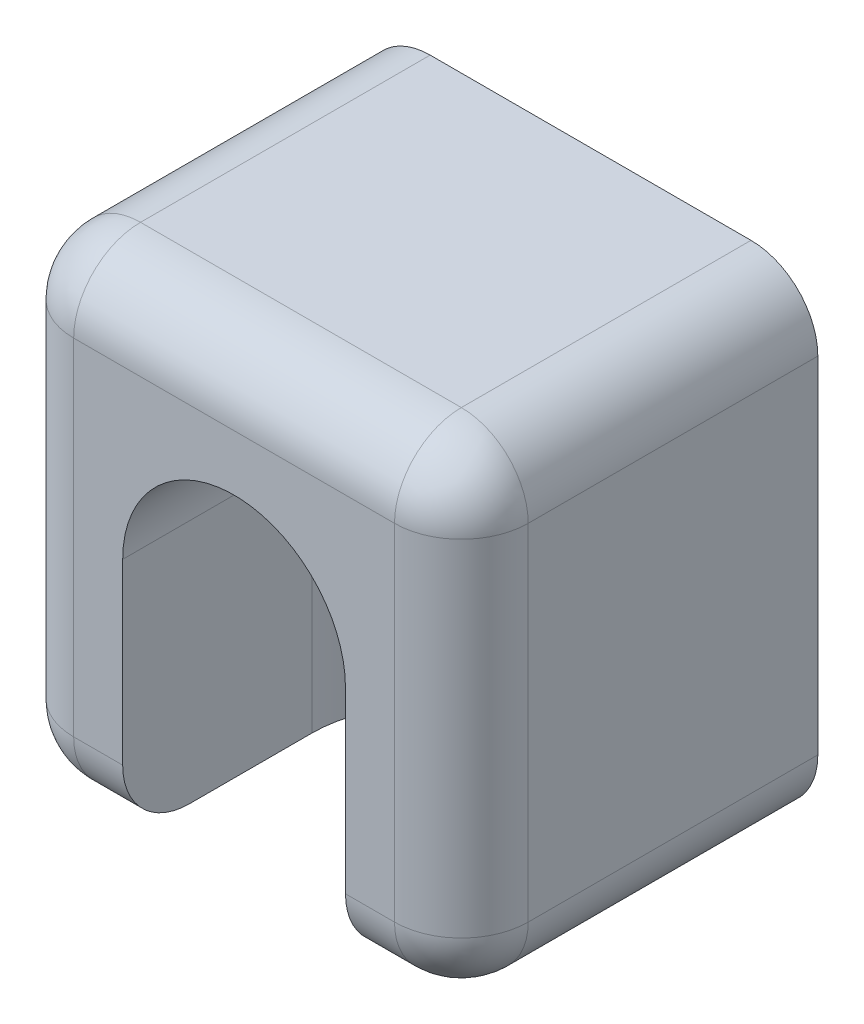
ISO-10303-21;
HEADER;
FILE_DESCRIPTION(('STEP AP214'),'2;1');
FILE_NAME('part.step','',(''),(''),'','','');
FILE_SCHEMA(('AUTOMOTIVE_DESIGN { 1 0 10303 214 1 1 1 1 }'));
ENDSEC;
DATA;
#1=APPLICATION_CONTEXT('core data for automotive mechanical design processes');
#2=APPLICATION_PROTOCOL_DEFINITION('international standard','automotive_design',2000,#1);
#3=PRODUCT_CONTEXT('',#1,'mechanical');
#4=PRODUCT('Part','Part','',(#3));
#5=PRODUCT_RELATED_PRODUCT_CATEGORY('part','',(#4));
#6=PRODUCT_DEFINITION_FORMATION('','',#4);
#7=PRODUCT_DEFINITION_CONTEXT('part definition',#1,'design');
#8=PRODUCT_DEFINITION('design','',#6,#7);
#9=PRODUCT_DEFINITION_SHAPE('','',#8);
#10=(LENGTH_UNIT() NAMED_UNIT(*) SI_UNIT(.MILLI.,.METRE.));
#11=(NAMED_UNIT(*) PLANE_ANGLE_UNIT() SI_UNIT($,.RADIAN.));
#12=(NAMED_UNIT(*) SI_UNIT($,.STERADIAN.) SOLID_ANGLE_UNIT());
#13=UNCERTAINTY_MEASURE_WITH_UNIT(LENGTH_MEASURE(1.E-05),#10,'distance_accuracy_value','');
#14=(GEOMETRIC_REPRESENTATION_CONTEXT(3) GLOBAL_UNCERTAINTY_ASSIGNED_CONTEXT((#13)) GLOBAL_UNIT_ASSIGNED_CONTEXT((#10,
#11,#12)) REPRESENTATION_CONTEXT('',''));
#15=CARTESIAN_POINT('',(0.,0.,0.));
#16=DIRECTION('',(0.,0.,1.));
#17=DIRECTION('',(1.,0.,0.));
#18=AXIS2_PLACEMENT_3D('',#15,#16,#17);
#19=CARTESIAN_POINT('',(10.2,0.,-8.5));
#20=DIRECTION('',(0.,1.,0.));
#21=DIRECTION('',(0.,0.,1.));
#22=AXIS2_PLACEMENT_3D('',#19,#20,#21);
#23=CYLINDRICAL_SURFACE('',#22,5.);
#24=DIRECTION('',(0.,1.,0.));
#25=VECTOR('',#24,1.);
#26=CARTESIAN_POINT('',(5.2,-0.999999999999999,-8.5));
#27=LINE('',#26,#25);
#28=CARTESIAN_POINT('',(5.2,0.,-8.5));
#29=VERTEX_POINT('',#28);
#30=CARTESIAN_POINT('',(5.2,11.,-8.5));
#31=VERTEX_POINT('',#30);
#32=EDGE_CURVE('E213',#29,#31,#27,.T.);
#33=ORIENTED_EDGE('',*,*,#32,.F.);
#34=CARTESIAN_POINT('',(10.2,0.,-8.5));
#35=DIRECTION('',(0.,-1.,0.));
#36=DIRECTION('',(0.,0.,-1.));
#37=AXIS2_PLACEMENT_3D('',#34,#35,#36);
#38=CIRCLE('',#37,5.);
#39=CARTESIAN_POINT('',(15.2,0.,-8.5));
#40=VERTEX_POINT('',#39);
#41=EDGE_CURVE('E11',#29,#40,#38,.T.);
#42=ORIENTED_EDGE('',*,*,#41,.T.);
#43=DIRECTION('',(0.,-1.,0.));
#44=VECTOR('',#43,1.);
#45=CARTESIAN_POINT('',(15.2,0.,-8.5));
#46=LINE('',#45,#44);
#47=CARTESIAN_POINT('',(15.2,11.,-8.5));
#48=VERTEX_POINT('',#47);
#49=EDGE_CURVE('E41',#48,#40,#46,.T.);
#50=ORIENTED_EDGE('',*,*,#49,.F.);
#51=CARTESIAN_POINT('',(10.2,11.,-8.5));
#52=DIRECTION('',(0.,0.707106781186547,0.707106781186547));
#53=DIRECTION('',(0.,0.707106781186548,-0.707106781186547));
#54=AXIS2_PLACEMENT_3D('',#51,#52,#53);
#55=ELLIPSE('',#54,7.07106781186547,5.);
#56=EDGE_CURVE('E216',#31,#48,#55,.F.);
#57=ORIENTED_EDGE('',*,*,#56,.F.);
#58=EDGE_LOOP('',(#33,#42,#50,#57));
#59=FACE_BOUND('',#58,.T.);
#60=ADVANCED_FACE('F34',(#59),#23,.F.);
#61=CARTESIAN_POINT('',(10.2,11.,-13.5));
#62=DIRECTION('',(0.,0.,1.));
#63=DIRECTION('',(1.,0.,0.));
#64=AXIS2_PLACEMENT_3D('',#61,#62,#63);
#65=CYLINDRICAL_SURFACE('',#64,5.);
#66=DIRECTION('',(0.,0.,1.));
#67=VECTOR('',#66,1.);
#68=CARTESIAN_POINT('',(5.2,11.,0.999999999999999));
#69=LINE('',#68,#67);
#70=CARTESIAN_POINT('',(5.2,11.,0.));
#71=VERTEX_POINT('',#70);
#72=EDGE_CURVE('E208',#31,#71,#69,.T.);
#73=ORIENTED_EDGE('',*,*,#72,.F.);
#74=ORIENTED_EDGE('',*,*,#56,.T.);
#75=DIRECTION('',(0.,0.,-1.));
#76=VECTOR('',#75,1.);
#77=CARTESIAN_POINT('',(15.2,11.,-13.5));
#78=LINE('',#77,#76);
#79=CARTESIAN_POINT('',(15.2,11.,0.));
#80=VERTEX_POINT('',#79);
#81=EDGE_CURVE('E210',#80,#48,#78,.T.);
#82=ORIENTED_EDGE('',*,*,#81,.F.);
#83=CARTESIAN_POINT('',(10.2,11.,0.));
#84=DIRECTION('',(0.,0.,-1.));
#85=DIRECTION('',(-1.,0.,0.));
#86=AXIS2_PLACEMENT_3D('',#83,#84,#85);
#87=CIRCLE('',#86,5.);
#88=EDGE_CURVE('E143',#80,#71,#87,.F.);
#89=ORIENTED_EDGE('',*,*,#88,.T.);
#90=EDGE_LOOP('',(#73,#74,#82,#89));
#91=FACE_BOUND('',#90,.T.);
#92=ADVANCED_FACE('F297',(#91),#65,.F.);
#93=CARTESIAN_POINT('',(0.,0.,-16.));
#94=DIRECTION('',(0.,-1.,0.));
#95=DIRECTION('',(0.,0.,-1.));
#96=AXIS2_PLACEMENT_3D('',#93,#94,#95);
#97=PLANE('',#96);
#98=ORIENTED_EDGE('',*,*,#41,.F.);
#99=DIRECTION('',(0.,0.,1.));
#100=VECTOR('',#99,1.);
#101=CARTESIAN_POINT('',(5.2,0.,-16.));
#102=LINE('',#101,#100);
#103=CARTESIAN_POINT('',(5.2,0.,-3.));
#104=VERTEX_POINT('',#103);
#105=EDGE_CURVE('E176',#29,#104,#102,.T.);
#106=ORIENTED_EDGE('',*,*,#105,.T.);
#107=DIRECTION('',(1.,0.,0.));
#108=VECTOR('',#107,1.);
#109=CARTESIAN_POINT('',(0.,0.,-3.));
#110=LINE('',#109,#108);
#111=CARTESIAN_POINT('',(3.,0.,-3.));
#112=VERTEX_POINT('',#111);
#113=EDGE_CURVE('E237',#104,#112,#110,.F.);
#114=ORIENTED_EDGE('',*,*,#113,.T.);
#115=DIRECTION('',(0.,0.,1.));
#116=VECTOR('',#115,1.);
#117=CARTESIAN_POINT('',(3.,0.,-16.));
#118=LINE('',#117,#116);
#119=CARTESIAN_POINT('',(3.,0.,-16.));
#120=VERTEX_POINT('',#119);
#121=EDGE_CURVE('E239',#112,#120,#118,.F.);
#122=ORIENTED_EDGE('',*,*,#121,.T.);
#123=DIRECTION('',(1.,0.,0.));
#124=VECTOR('',#123,1.);
#125=CARTESIAN_POINT('',(0.,0.,-16.));
#126=LINE('',#125,#124);
#127=CARTESIAN_POINT('',(17.4,0.,-16.));
#128=VERTEX_POINT('',#127);
#129=EDGE_CURVE('E228',#120,#128,#126,.T.);
#130=ORIENTED_EDGE('',*,*,#129,.T.);
#131=DIRECTION('',(0.,0.,1.));
#132=VECTOR('',#131,1.);
#133=CARTESIAN_POINT('',(17.4,0.,-16.));
#134=LINE('',#133,#132);
#135=CARTESIAN_POINT('',(17.4,0.,-3.));
#136=VERTEX_POINT('',#135);
#137=EDGE_CURVE('E241',#128,#136,#134,.T.);
#138=ORIENTED_EDGE('',*,*,#137,.T.);
#139=CARTESIAN_POINT('',(15.2,0.,-3.));
#140=VERTEX_POINT('',#139);
#141=EDGE_CURVE('E220',#136,#140,#110,.F.);
#142=ORIENTED_EDGE('',*,*,#141,.T.);
#143=DIRECTION('',(0.,0.,1.));
#144=VECTOR('',#143,1.);
#145=CARTESIAN_POINT('',(15.2,0.,-16.));
#146=LINE('',#145,#144);
#147=EDGE_CURVE('E147',#40,#140,#146,.T.);
#148=ORIENTED_EDGE('',*,*,#147,.F.);
#149=EDGE_LOOP('',(#98,#106,#114,#122,#130,#138,#142,#148));
#150=FACE_BOUND('',#149,.T.);
#151=ADVANCED_FACE('F218',(#150),#97,.T.);
#152=CARTESIAN_POINT('',(0.,21.5,0.));
#153=DIRECTION('',(0.,0.,-1.));
#154=DIRECTION('',(-1.,0.,0.));
#155=AXIS2_PLACEMENT_3D('',#152,#153,#154);
#156=PLANE('',#155);
#157=ORIENTED_EDGE('',*,*,#88,.F.);
#158=DIRECTION('',(0.,-1.,0.));
#159=VECTOR('',#158,1.);
#160=CARTESIAN_POINT('',(15.2,21.5,0.));
#161=LINE('',#160,#159);
#162=CARTESIAN_POINT('',(15.2,3.,0.));
#163=VERTEX_POINT('',#162);
#164=EDGE_CURVE('E134',#80,#163,#161,.T.);
#165=ORIENTED_EDGE('',*,*,#164,.T.);
#166=DIRECTION('',(1.,0.,0.));
#167=VECTOR('',#166,1.);
#168=CARTESIAN_POINT('',(20.4,3.,0.));
#169=LINE('',#168,#167);
#170=CARTESIAN_POINT('',(17.4,3.,0.));
#171=VERTEX_POINT('',#170);
#172=EDGE_CURVE('E139',#163,#171,#169,.T.);
#173=ORIENTED_EDGE('',*,*,#172,.T.);
#174=DIRECTION('',(0.,1.,0.));
#175=VECTOR('',#174,1.);
#176=CARTESIAN_POINT('',(17.4,21.5,0.));
#177=LINE('',#176,#175);
#178=CARTESIAN_POINT('',(17.4,18.5,0.));
#179=VERTEX_POINT('',#178);
#180=EDGE_CURVE('E157',#171,#179,#177,.T.);
#181=ORIENTED_EDGE('',*,*,#180,.T.);
#182=DIRECTION('',(-1.,0.,0.));
#183=VECTOR('',#182,1.);
#184=CARTESIAN_POINT('',(0.,18.5,0.));
#185=LINE('',#184,#183);
#186=CARTESIAN_POINT('',(3.,18.5,0.));
#187=VERTEX_POINT('',#186);
#188=EDGE_CURVE('E168',#179,#187,#185,.T.);
#189=ORIENTED_EDGE('',*,*,#188,.T.);
#190=DIRECTION('',(0.,-1.,0.));
#191=VECTOR('',#190,1.);
#192=CARTESIAN_POINT('',(3.,0.,0.));
#193=LINE('',#192,#191);
#194=CARTESIAN_POINT('',(3.,3.,0.));
#195=VERTEX_POINT('',#194);
#196=EDGE_CURVE('E165',#187,#195,#193,.T.);
#197=ORIENTED_EDGE('',*,*,#196,.T.);
#198=CARTESIAN_POINT('',(5.2,3.,0.));
#199=VERTEX_POINT('',#198);
#200=EDGE_CURVE('E164',#195,#199,#169,.T.);
#201=ORIENTED_EDGE('',*,*,#200,.T.);
#202=DIRECTION('',(0.,-1.,0.));
#203=VECTOR('',#202,1.);
#204=CARTESIAN_POINT('',(5.2,21.5,0.));
#205=LINE('',#204,#203);
#206=EDGE_CURVE('E221',#71,#199,#205,.T.);
#207=ORIENTED_EDGE('',*,*,#206,.F.);
#208=EDGE_LOOP('',(#157,#165,#173,#181,#189,#197,#201,#207));
#209=FACE_BOUND('',#208,.T.);
#210=ADVANCED_FACE('F136',(#209),#156,.F.);
#211=CARTESIAN_POINT('',(0.,3.,-3.));
#212=DIRECTION('',(-1.,0.,0.));
#213=DIRECTION('',(0.,0.,1.));
#214=AXIS2_PLACEMENT_3D('',#211,#212,#213);
#215=CYLINDRICAL_SURFACE('',#214,3.);
#216=ORIENTED_EDGE('',*,*,#113,.F.);
#217=CARTESIAN_POINT('',(5.2,3.,-3.));
#218=DIRECTION('',(1.,0.,0.));
#219=DIRECTION('',(0.,0.,-1.));
#220=AXIS2_PLACEMENT_3D('',#217,#218,#219);
#221=CIRCLE('',#220,3.);
#222=EDGE_CURVE('E156',#104,#199,#221,.F.);
#223=ORIENTED_EDGE('',*,*,#222,.T.);
#224=ORIENTED_EDGE('',*,*,#200,.F.);
#225=CARTESIAN_POINT('',(3.,3.,-3.));
#226=DIRECTION('',(-1.,0.,0.));
#227=DIRECTION('',(0.,0.,1.));
#228=AXIS2_PLACEMENT_3D('',#225,#226,#227);
#229=CIRCLE('',#228,3.);
#230=EDGE_CURVE('E181',#195,#112,#229,.F.);
#231=ORIENTED_EDGE('',*,*,#230,.T.);
#232=EDGE_LOOP('',(#216,#223,#224,#231));
#233=FACE_BOUND('',#232,.T.);
#234=ADVANCED_FACE('F290',(#233),#215,.T.);
#235=CARTESIAN_POINT('',(0.,0.,-16.));
#236=DIRECTION('',(-1.,0.,0.));
#237=DIRECTION('',(0.,0.,1.));
#238=AXIS2_PLACEMENT_3D('',#235,#236,#237);
#239=PLANE('',#238);
#240=DIRECTION('',(0.,-1.,0.));
#241=VECTOR('',#240,1.);
#242=CARTESIAN_POINT('',(0.,21.5,-3.));
#243=LINE('',#242,#241);
#244=CARTESIAN_POINT('',(0.,3.,-3.));
#245=VERTEX_POINT('',#244);
#246=CARTESIAN_POINT('',(0.,18.5,-3.));
#247=VERTEX_POINT('',#246);
#248=EDGE_CURVE('E263',#245,#247,#243,.F.);
#249=ORIENTED_EDGE('',*,*,#248,.T.);
#250=DIRECTION('',(0.,0.,1.));
#251=VECTOR('',#250,1.);
#252=CARTESIAN_POINT('',(0.,18.5,-16.));
#253=LINE('',#252,#251);
#254=CARTESIAN_POINT('',(0.,18.5,-16.));
#255=VERTEX_POINT('',#254);
#256=EDGE_CURVE('E267',#247,#255,#253,.F.);
#257=ORIENTED_EDGE('',*,*,#256,.T.);
#258=DIRECTION('',(0.,-1.,0.));
#259=VECTOR('',#258,1.);
#260=CARTESIAN_POINT('',(0.,0.,-16.));
#261=LINE('',#260,#259);
#262=CARTESIAN_POINT('',(0.,3.,-16.));
#263=VERTEX_POINT('',#262);
#264=EDGE_CURVE('E204',#255,#263,#261,.T.);
#265=ORIENTED_EDGE('',*,*,#264,.T.);
#266=DIRECTION('',(0.,0.,1.));
#267=VECTOR('',#266,1.);
#268=CARTESIAN_POINT('',(0.,3.,-16.));
#269=LINE('',#268,#267);
#270=EDGE_CURVE('E265',#263,#245,#269,.T.);
#271=ORIENTED_EDGE('',*,*,#270,.T.);
#272=EDGE_LOOP('',(#249,#257,#265,#271));
#273=FACE_BOUND('',#272,.T.);
#274=ADVANCED_FACE('F310',(#273),#239,.T.);
#275=CARTESIAN_POINT('',(0.,21.5,-16.));
#276=DIRECTION('',(0.,1.,0.));
#277=DIRECTION('',(0.,0.,1.));
#278=AXIS2_PLACEMENT_3D('',#275,#276,#277);
#279=PLANE('',#278);
#280=DIRECTION('',(-1.,0.,0.));
#281=VECTOR('',#280,1.);
#282=CARTESIAN_POINT('',(20.4,21.5,-3.));
#283=LINE('',#282,#281);
#284=CARTESIAN_POINT('',(3.,21.5,-3.));
#285=VERTEX_POINT('',#284);
#286=CARTESIAN_POINT('',(17.4,21.5,-3.));
#287=VERTEX_POINT('',#286);
#288=EDGE_CURVE('E257',#285,#287,#283,.F.);
#289=ORIENTED_EDGE('',*,*,#288,.T.);
#290=DIRECTION('',(0.,0.,1.));
#291=VECTOR('',#290,1.);
#292=CARTESIAN_POINT('',(17.4,21.5,-16.));
#293=LINE('',#292,#291);
#294=CARTESIAN_POINT('',(17.4,21.5,-16.));
#295=VERTEX_POINT('',#294);
#296=EDGE_CURVE('E261',#287,#295,#293,.F.);
#297=ORIENTED_EDGE('',*,*,#296,.T.);
#298=DIRECTION('',(-1.,0.,0.));
#299=VECTOR('',#298,1.);
#300=CARTESIAN_POINT('',(0.,21.5,-16.));
#301=LINE('',#300,#299);
#302=CARTESIAN_POINT('',(3.,21.5,-16.));
#303=VERTEX_POINT('',#302);
#304=EDGE_CURVE('E234',#295,#303,#301,.T.);
#305=ORIENTED_EDGE('',*,*,#304,.T.);
#306=DIRECTION('',(0.,0.,1.));
#307=VECTOR('',#306,1.);
#308=CARTESIAN_POINT('',(3.,21.5,-16.));
#309=LINE('',#308,#307);
#310=EDGE_CURVE('E259',#303,#285,#309,.T.);
#311=ORIENTED_EDGE('',*,*,#310,.T.);
#312=EDGE_LOOP('',(#289,#297,#305,#311));
#313=FACE_BOUND('',#312,.T.);
#314=ADVANCED_FACE('F318',(#313),#279,.T.);
#315=CARTESIAN_POINT('',(20.4,0.,-16.));
#316=DIRECTION('',(1.,0.,0.));
#317=DIRECTION('',(0.,0.,-1.));
#318=AXIS2_PLACEMENT_3D('',#315,#316,#317);
#319=PLANE('',#318);
#320=DIRECTION('',(0.,1.,0.));
#321=VECTOR('',#320,1.);
#322=CARTESIAN_POINT('',(20.4,0.,-3.));
#323=LINE('',#322,#321);
#324=CARTESIAN_POINT('',(20.4,18.5,-3.));
#325=VERTEX_POINT('',#324);
#326=CARTESIAN_POINT('',(20.4,3.,-3.));
#327=VERTEX_POINT('',#326);
#328=EDGE_CURVE('E243',#325,#327,#323,.F.);
#329=ORIENTED_EDGE('',*,*,#328,.T.);
#330=DIRECTION('',(0.,0.,1.));
#331=VECTOR('',#330,1.);
#332=CARTESIAN_POINT('',(20.4,3.,-16.));
#333=LINE('',#332,#331);
#334=CARTESIAN_POINT('',(20.4,3.,-16.));
#335=VERTEX_POINT('',#334);
#336=EDGE_CURVE('E247',#327,#335,#333,.F.);
#337=ORIENTED_EDGE('',*,*,#336,.T.);
#338=DIRECTION('',(0.,1.,0.));
#339=VECTOR('',#338,1.);
#340=CARTESIAN_POINT('',(20.4,0.,-16.));
#341=LINE('',#340,#339);
#342=CARTESIAN_POINT('',(20.4,18.5,-16.));
#343=VERTEX_POINT('',#342);
#344=EDGE_CURVE('E231',#335,#343,#341,.T.);
#345=ORIENTED_EDGE('',*,*,#344,.T.);
#346=DIRECTION('',(0.,0.,1.));
#347=VECTOR('',#346,1.);
#348=CARTESIAN_POINT('',(20.4,18.5,-16.));
#349=LINE('',#348,#347);
#350=EDGE_CURVE('E245',#343,#325,#349,.T.);
#351=ORIENTED_EDGE('',*,*,#350,.T.);
#352=EDGE_LOOP('',(#329,#337,#345,#351));
#353=FACE_BOUND('',#352,.T.);
#354=ADVANCED_FACE('F333',(#353),#319,.T.);
#355=CARTESIAN_POINT('',(0.,21.5,-16.));
#356=DIRECTION('',(0.,0.,-1.));
#357=DIRECTION('',(-1.,0.,0.));
#358=AXIS2_PLACEMENT_3D('',#355,#356,#357);
#359=PLANE('',#358);
#360=ORIENTED_EDGE('',*,*,#344,.F.);
#361=CARTESIAN_POINT('',(17.4,3.,-16.));
#362=DIRECTION('',(0.,0.,-1.));
#363=DIRECTION('',(-1.,0.,0.));
#364=AXIS2_PLACEMENT_3D('',#361,#362,#363);
#365=CIRCLE('',#364,3.);
#366=EDGE_CURVE('E255',#335,#128,#365,.T.);
#367=ORIENTED_EDGE('',*,*,#366,.T.);
#368=ORIENTED_EDGE('',*,*,#129,.F.);
#369=CARTESIAN_POINT('',(3.,3.,-16.));
#370=DIRECTION('',(0.,0.,-1.));
#371=DIRECTION('',(-1.,0.,0.));
#372=AXIS2_PLACEMENT_3D('',#369,#370,#371);
#373=CIRCLE('',#372,3.);
#374=EDGE_CURVE('E249',#120,#263,#373,.T.);
#375=ORIENTED_EDGE('',*,*,#374,.T.);
#376=ORIENTED_EDGE('',*,*,#264,.F.);
#377=CARTESIAN_POINT('',(3.,18.5,-16.));
#378=DIRECTION('',(0.,0.,-1.));
#379=DIRECTION('',(-1.,0.,0.));
#380=AXIS2_PLACEMENT_3D('',#377,#378,#379);
#381=CIRCLE('',#380,3.);
#382=EDGE_CURVE('E251',#255,#303,#381,.T.);
#383=ORIENTED_EDGE('',*,*,#382,.T.);
#384=ORIENTED_EDGE('',*,*,#304,.F.);
#385=CARTESIAN_POINT('',(17.4,18.5,-16.));
#386=DIRECTION('',(0.,0.,-1.));
#387=DIRECTION('',(-1.,0.,0.));
#388=AXIS2_PLACEMENT_3D('',#385,#386,#387);
#389=CIRCLE('',#388,3.);
#390=EDGE_CURVE('E253',#295,#343,#389,.T.);
#391=ORIENTED_EDGE('',*,*,#390,.T.);
#392=EDGE_LOOP('',(#360,#367,#368,#375,#376,#383,#384,#391));
#393=FACE_BOUND('',#392,.T.);
#394=ADVANCED_FACE('F307',(#393),#359,.T.);
#395=CARTESIAN_POINT('',(3.,18.5,-16.));
#396=DIRECTION('',(0.,0.,1.));
#397=DIRECTION('',(1.,0.,0.));
#398=AXIS2_PLACEMENT_3D('',#395,#396,#397);
#399=CYLINDRICAL_SURFACE('',#398,3.);
#400=CARTESIAN_POINT('',(3.,18.5,-3.));
#401=DIRECTION('',(0.,0.,1.));
#402=DIRECTION('',(1.,0.,0.));
#403=AXIS2_PLACEMENT_3D('',#400,#401,#402);
#404=CIRCLE('',#403,3.);
#405=EDGE_CURVE('E202',#285,#247,#404,.T.);
#406=ORIENTED_EDGE('',*,*,#405,.F.);
#407=ORIENTED_EDGE('',*,*,#310,.F.);
#408=ORIENTED_EDGE('',*,*,#382,.F.);
#409=ORIENTED_EDGE('',*,*,#256,.F.);
#410=EDGE_LOOP('',(#406,#407,#408,#409));
#411=FACE_BOUND('',#410,.T.);
#412=ADVANCED_FACE('F313',(#411),#399,.T.);
#413=CARTESIAN_POINT('',(3.,18.5,-3.));
#414=DIRECTION('',(0.,0.,1.));
#415=DIRECTION('',(1.,0.,0.));
#416=AXIS2_PLACEMENT_3D('',#413,#414,#415);
#417=SPHERICAL_SURFACE('',#416,3.);
#418=CARTESIAN_POINT('',(3.,18.5,-3.));
#419=DIRECTION('',(-1.,0.,0.));
#420=DIRECTION('',(0.,0.,1.));
#421=AXIS2_PLACEMENT_3D('',#418,#419,#420);
#422=CIRCLE('',#421,3.);
#423=EDGE_CURVE('E196',#285,#187,#422,.F.);
#424=ORIENTED_EDGE('',*,*,#423,.F.);
#425=ORIENTED_EDGE('',*,*,#405,.T.);
#426=CARTESIAN_POINT('',(3.,18.5,-3.));
#427=DIRECTION('',(0.,1.,0.));
#428=DIRECTION('',(0.,0.,1.));
#429=AXIS2_PLACEMENT_3D('',#426,#427,#428);
#430=CIRCLE('',#429,3.);
#431=EDGE_CURVE('E199',#187,#247,#430,.F.);
#432=ORIENTED_EDGE('',*,*,#431,.F.);
#433=EDGE_LOOP('',(#424,#425,#432));
#434=FACE_BOUND('',#433,.T.);
#435=ADVANCED_FACE('F278',(#434),#417,.T.);
#436=CARTESIAN_POINT('',(3.,3.,-16.));
#437=DIRECTION('',(0.,0.,1.));
#438=DIRECTION('',(1.,0.,0.));
#439=AXIS2_PLACEMENT_3D('',#436,#437,#438);
#440=CYLINDRICAL_SURFACE('',#439,3.);
#441=ORIENTED_EDGE('',*,*,#374,.F.);
#442=ORIENTED_EDGE('',*,*,#121,.F.);
#443=CARTESIAN_POINT('',(3.,3.,-3.));
#444=DIRECTION('',(0.,0.,1.));
#445=DIRECTION('',(1.,0.,0.));
#446=AXIS2_PLACEMENT_3D('',#443,#444,#445);
#447=CIRCLE('',#446,3.);
#448=EDGE_CURVE('E193',#245,#112,#447,.T.);
#449=ORIENTED_EDGE('',*,*,#448,.F.);
#450=ORIENTED_EDGE('',*,*,#270,.F.);
#451=EDGE_LOOP('',(#441,#442,#449,#450));
#452=FACE_BOUND('',#451,.T.);
#453=ADVANCED_FACE('F302',(#452),#440,.T.);
#454=CARTESIAN_POINT('',(3.,21.5,-3.));
#455=DIRECTION('',(0.,1.,0.));
#456=DIRECTION('',(0.,0.,1.));
#457=AXIS2_PLACEMENT_3D('',#454,#455,#456);
#458=CYLINDRICAL_SURFACE('',#457,3.);
#459=ORIENTED_EDGE('',*,*,#431,.T.);
#460=ORIENTED_EDGE('',*,*,#248,.F.);
#461=CARTESIAN_POINT('',(3.,3.,-3.));
#462=DIRECTION('',(0.,-1.,0.));
#463=DIRECTION('',(1.,0.,0.));
#464=AXIS2_PLACEMENT_3D('',#461,#462,#463);
#465=CIRCLE('',#464,3.);
#466=EDGE_CURVE('E190',#195,#245,#465,.T.);
#467=ORIENTED_EDGE('',*,*,#466,.F.);
#468=ORIENTED_EDGE('',*,*,#196,.F.);
#469=EDGE_LOOP('',(#459,#460,#467,#468));
#470=FACE_BOUND('',#469,.T.);
#471=ADVANCED_FACE('F282',(#470),#458,.T.);
#472=CARTESIAN_POINT('',(0.,18.5,-3.));
#473=DIRECTION('',(1.,0.,0.));
#474=DIRECTION('',(0.,0.,-1.));
#475=AXIS2_PLACEMENT_3D('',#472,#473,#474);
#476=CYLINDRICAL_SURFACE('',#475,3.);
#477=ORIENTED_EDGE('',*,*,#423,.T.);
#478=ORIENTED_EDGE('',*,*,#188,.F.);
#479=CARTESIAN_POINT('',(17.4,18.5,-3.));
#480=DIRECTION('',(1.,0.,0.));
#481=DIRECTION('',(0.,0.,-1.));
#482=AXIS2_PLACEMENT_3D('',#479,#480,#481);
#483=CIRCLE('',#482,3.);
#484=EDGE_CURVE('E187',#287,#179,#483,.T.);
#485=ORIENTED_EDGE('',*,*,#484,.F.);
#486=ORIENTED_EDGE('',*,*,#288,.F.);
#487=EDGE_LOOP('',(#477,#478,#485,#486));
#488=FACE_BOUND('',#487,.T.);
#489=ADVANCED_FACE('F276',(#488),#476,.T.);
#490=CARTESIAN_POINT('',(17.4,18.5,-16.));
#491=DIRECTION('',(0.,0.,1.));
#492=DIRECTION('',(1.,0.,0.));
#493=AXIS2_PLACEMENT_3D('',#490,#491,#492);
#494=CYLINDRICAL_SURFACE('',#493,3.);
#495=ORIENTED_EDGE('',*,*,#390,.F.);
#496=ORIENTED_EDGE('',*,*,#296,.F.);
#497=CARTESIAN_POINT('',(17.4,18.5,-3.));
#498=DIRECTION('',(0.,0.,1.));
#499=DIRECTION('',(1.,0.,0.));
#500=AXIS2_PLACEMENT_3D('',#497,#498,#499);
#501=CIRCLE('',#500,3.);
#502=EDGE_CURVE('E184',#325,#287,#501,.T.);
#503=ORIENTED_EDGE('',*,*,#502,.F.);
#504=ORIENTED_EDGE('',*,*,#350,.F.);
#505=EDGE_LOOP('',(#495,#496,#503,#504));
#506=FACE_BOUND('',#505,.T.);
#507=ADVANCED_FACE('F322',(#506),#494,.T.);
#508=CARTESIAN_POINT('',(3.,3.,-3.));
#509=DIRECTION('',(0.,0.,1.));
#510=DIRECTION('',(1.,0.,0.));
#511=AXIS2_PLACEMENT_3D('',#508,#509,#510);
#512=SPHERICAL_SURFACE('',#511,3.);
#513=ORIENTED_EDGE('',*,*,#466,.T.);
#514=ORIENTED_EDGE('',*,*,#448,.T.);
#515=ORIENTED_EDGE('',*,*,#230,.F.);
#516=EDGE_LOOP('',(#513,#514,#515));
#517=FACE_BOUND('',#516,.T.);
#518=ADVANCED_FACE('F287',(#517),#512,.T.);
#519=CARTESIAN_POINT('',(17.4,18.5,-3.));
#520=DIRECTION('',(0.,0.,1.));
#521=DIRECTION('',(1.,0.,0.));
#522=AXIS2_PLACEMENT_3D('',#519,#520,#521);
#523=SPHERICAL_SURFACE('',#522,3.);
#524=ORIENTED_EDGE('',*,*,#502,.T.);
#525=ORIENTED_EDGE('',*,*,#484,.T.);
#526=CARTESIAN_POINT('',(17.4,18.5,-3.));
#527=DIRECTION('',(0.,1.,0.));
#528=DIRECTION('',(0.,0.,1.));
#529=AXIS2_PLACEMENT_3D('',#526,#527,#528);
#530=CIRCLE('',#529,3.);
#531=EDGE_CURVE('E179',#325,#179,#530,.F.);
#532=ORIENTED_EDGE('',*,*,#531,.F.);
#533=EDGE_LOOP('',(#524,#525,#532));
#534=FACE_BOUND('',#533,.T.);
#535=ADVANCED_FACE('F326',(#534),#523,.T.);
#536=CARTESIAN_POINT('',(15.2,3.,-3.));
#537=DIRECTION('',(1.,0.,0.));
#538=DIRECTION('',(0.,0.,-1.));
#539=AXIS2_PLACEMENT_3D('',#536,#537,#538);
#540=CIRCLE('',#539,3.);
#541=EDGE_CURVE('E150',#140,#163,#540,.F.);
#542=ORIENTED_EDGE('',*,*,#541,.F.);
#543=ORIENTED_EDGE('',*,*,#141,.F.);
#544=CARTESIAN_POINT('',(17.4,3.,-3.));
#545=DIRECTION('',(1.,0.,0.));
#546=DIRECTION('',(0.,0.,-1.));
#547=AXIS2_PLACEMENT_3D('',#544,#545,#546);
#548=CIRCLE('',#547,3.);
#549=EDGE_CURVE('E162',#171,#136,#548,.T.);
#550=ORIENTED_EDGE('',*,*,#549,.F.);
#551=ORIENTED_EDGE('',*,*,#172,.F.);
#552=EDGE_LOOP('',(#542,#543,#550,#551));
#553=FACE_BOUND('',#552,.T.);
#554=ADVANCED_FACE('F160',(#553),#215,.T.);
#555=CARTESIAN_POINT('',(17.4,21.5,-3.));
#556=DIRECTION('',(0.,-1.,0.));
#557=DIRECTION('',(0.,0.,-1.));
#558=AXIS2_PLACEMENT_3D('',#555,#556,#557);
#559=CYLINDRICAL_SURFACE('',#558,3.);
#560=ORIENTED_EDGE('',*,*,#531,.T.);
#561=ORIENTED_EDGE('',*,*,#180,.F.);
#562=CARTESIAN_POINT('',(17.4,3.,-3.));
#563=DIRECTION('',(0.,-1.,0.));
#564=DIRECTION('',(0.,0.,-1.));
#565=AXIS2_PLACEMENT_3D('',#562,#563,#564);
#566=CIRCLE('',#565,3.);
#567=EDGE_CURVE('E175',#327,#171,#566,.T.);
#568=ORIENTED_EDGE('',*,*,#567,.F.);
#569=ORIENTED_EDGE('',*,*,#328,.F.);
#570=EDGE_LOOP('',(#560,#561,#568,#569));
#571=FACE_BOUND('',#570,.T.);
#572=ADVANCED_FACE('F330',(#571),#559,.T.);
#573=CARTESIAN_POINT('',(17.4,3.,-3.));
#574=DIRECTION('',(0.,0.,1.));
#575=DIRECTION('',(1.,0.,0.));
#576=AXIS2_PLACEMENT_3D('',#573,#574,#575);
#577=SPHERICAL_SURFACE('',#576,3.);
#578=ORIENTED_EDGE('',*,*,#567,.T.);
#579=ORIENTED_EDGE('',*,*,#549,.T.);
#580=CARTESIAN_POINT('',(17.4,3.,-3.));
#581=DIRECTION('',(0.,0.,1.));
#582=DIRECTION('',(1.,0.,0.));
#583=AXIS2_PLACEMENT_3D('',#580,#581,#582);
#584=CIRCLE('',#583,3.);
#585=EDGE_CURVE('E173',#327,#136,#584,.F.);
#586=ORIENTED_EDGE('',*,*,#585,.F.);
#587=EDGE_LOOP('',(#578,#579,#586));
#588=FACE_BOUND('',#587,.T.);
#589=ADVANCED_FACE('F340',(#588),#577,.T.);
#590=CARTESIAN_POINT('',(17.4,3.,-16.));
#591=DIRECTION('',(0.,0.,1.));
#592=DIRECTION('',(1.,0.,0.));
#593=AXIS2_PLACEMENT_3D('',#590,#591,#592);
#594=CYLINDRICAL_SURFACE('',#593,3.);
#595=ORIENTED_EDGE('',*,*,#366,.F.);
#596=ORIENTED_EDGE('',*,*,#336,.F.);
#597=ORIENTED_EDGE('',*,*,#585,.T.);
#598=ORIENTED_EDGE('',*,*,#137,.F.);
#599=EDGE_LOOP('',(#595,#596,#597,#598));
#600=FACE_BOUND('',#599,.T.);
#601=ADVANCED_FACE('F337',(#600),#594,.T.);
#602=CARTESIAN_POINT('',(5.2,-1.,0.999999999999999));
#603=DIRECTION('',(1.,0.,0.));
#604=DIRECTION('',(0.,0.,-1.));
#605=AXIS2_PLACEMENT_3D('',#602,#603,#604);
#606=PLANE('',#605);
#607=ORIENTED_EDGE('',*,*,#105,.F.);
#608=ORIENTED_EDGE('',*,*,#32,.T.);
#609=ORIENTED_EDGE('',*,*,#72,.T.);
#610=ORIENTED_EDGE('',*,*,#206,.T.);
#611=ORIENTED_EDGE('',*,*,#222,.F.);
#612=EDGE_LOOP('',(#607,#608,#609,#610,#611));
#613=FACE_BOUND('',#612,.T.);
#614=ADVANCED_FACE('F294',(#613),#606,.T.);
#615=CARTESIAN_POINT('',(15.2,-1.,0.999999999999999));
#616=DIRECTION('',(1.,0.,0.));
#617=DIRECTION('',(0.,0.,-1.));
#618=AXIS2_PLACEMENT_3D('',#615,#616,#617);
#619=PLANE('',#618);
#620=ORIENTED_EDGE('',*,*,#81,.T.);
#621=ORIENTED_EDGE('',*,*,#49,.T.);
#622=ORIENTED_EDGE('',*,*,#147,.T.);
#623=ORIENTED_EDGE('',*,*,#541,.T.);
#624=ORIENTED_EDGE('',*,*,#164,.F.);
#625=EDGE_LOOP('',(#620,#621,#622,#623,#624));
#626=FACE_BOUND('',#625,.T.);
#627=ADVANCED_FACE('F151',(#626),#619,.F.);
#628=CLOSED_SHELL('',(#60,#92,#151,#210,#234,#274,#314,#354,#394,#412,#435,#453,#471,#489,#507,
#518,#535,#554,#572,#589,#601,#614,#627));
#629=MANIFOLD_SOLID_BREP('B2',#628);
#630=ADVANCED_BREP_SHAPE_REPRESENTATION('',(#18,#629),#14);
#631=SHAPE_DEFINITION_REPRESENTATION(#9,#630);
ENDSEC;
END-ISO-10303-21;
